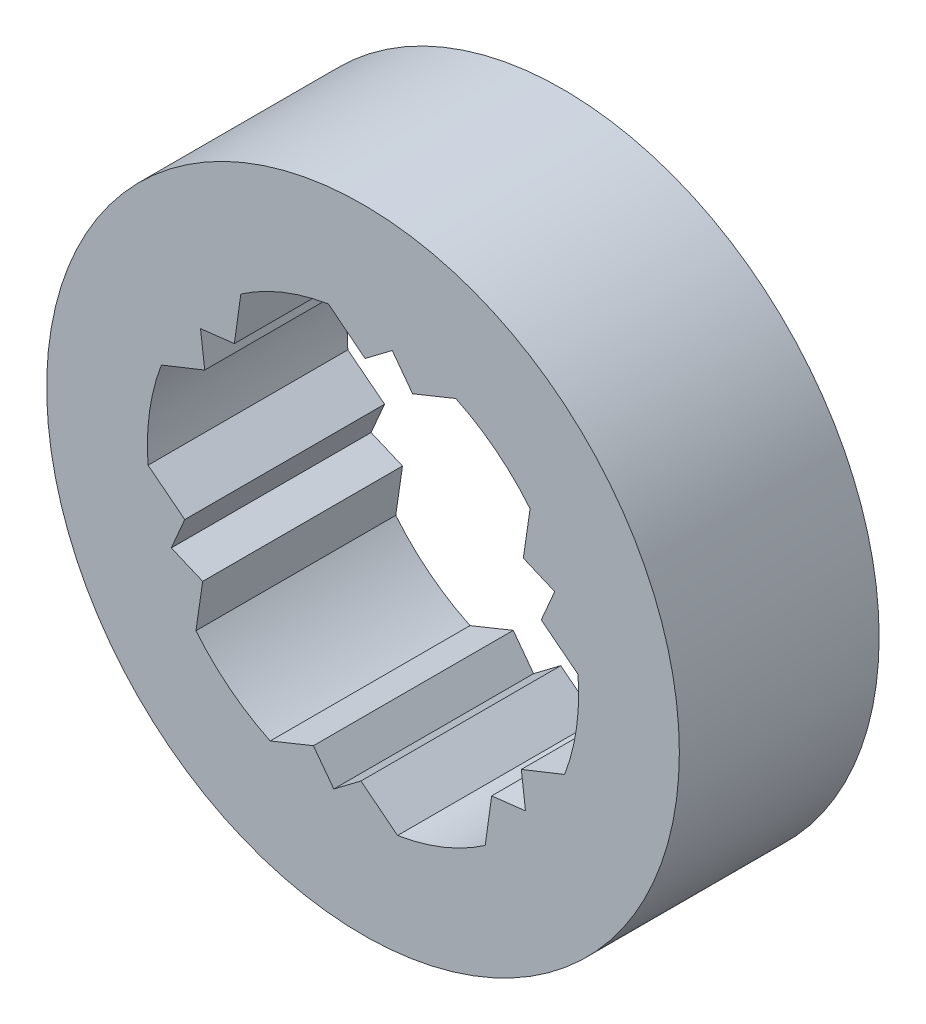
ISO-10303-21;
HEADER;
FILE_DESCRIPTION(('STEP AP214'),'2;1');
FILE_NAME('part.step','',(''),(''),'','','');
FILE_SCHEMA(('AUTOMOTIVE_DESIGN { 1 0 10303 214 1 1 1 1 }'));
ENDSEC;
DATA;
#1=APPLICATION_CONTEXT('core data for automotive mechanical design processes');
#2=APPLICATION_PROTOCOL_DEFINITION('international standard','automotive_design',2000,#1);
#3=PRODUCT_CONTEXT('',#1,'mechanical');
#4=PRODUCT('Part','Part','',(#3));
#5=PRODUCT_RELATED_PRODUCT_CATEGORY('part','',(#4));
#6=PRODUCT_DEFINITION_FORMATION('','',#4);
#7=PRODUCT_DEFINITION_CONTEXT('part definition',#1,'design');
#8=PRODUCT_DEFINITION('design','',#6,#7);
#9=PRODUCT_DEFINITION_SHAPE('','',#8);
#10=(LENGTH_UNIT() NAMED_UNIT(*) SI_UNIT(.MILLI.,.METRE.));
#11=(NAMED_UNIT(*) PLANE_ANGLE_UNIT() SI_UNIT($,.RADIAN.));
#12=(NAMED_UNIT(*) SI_UNIT($,.STERADIAN.) SOLID_ANGLE_UNIT());
#13=UNCERTAINTY_MEASURE_WITH_UNIT(LENGTH_MEASURE(1.E-05),#10,'distance_accuracy_value','');
#14=(GEOMETRIC_REPRESENTATION_CONTEXT(3) GLOBAL_UNCERTAINTY_ASSIGNED_CONTEXT((#13)) GLOBAL_UNIT_ASSIGNED_CONTEXT((#10,
#11,#12)) REPRESENTATION_CONTEXT('',''));
#15=CARTESIAN_POINT('',(0.,0.,0.));
#16=DIRECTION('',(0.,0.,1.));
#17=DIRECTION('',(1.,0.,0.));
#18=AXIS2_PLACEMENT_3D('',#15,#16,#17);
#19=CARTESIAN_POINT('',(-6.12693578866868,33.5955695744337,3.));
#20=DIRECTION('',(0.,0.,1.));
#21=DIRECTION('',(1.,0.,0.));
#22=AXIS2_PLACEMENT_3D('',#19,#20,#21);
#23=PLANE('',#22);
#24=CARTESIAN_POINT('',(-6.12693578866868,33.5955695744337,3.));
#25=DIRECTION('',(0.,0.,1.));
#26=DIRECTION('',(1.,0.,0.));
#27=AXIS2_PLACEMENT_3D('',#24,#25,#26);
#28=CIRCLE('',#27,4.74999999999999);
#29=CARTESIAN_POINT('',(-1.37693578866869,33.5955695744337,3.));
#30=VERTEX_POINT('',#29);
#31=EDGE_CURVE('E11',#30,#30,#28,.T.);
#32=ORIENTED_EDGE('',*,*,#31,.T.);
#33=EDGE_LOOP('',(#32));
#34=FACE_BOUND('',#33,.T.);
#35=DIRECTION('',(0.13844932774247,0.990369518739172,0.));
#36=VECTOR('',#35,1.);
#37=CARTESIAN_POINT('',(-4.19526989703299,31.62071296052,3.));
#38=LINE('',#37,#36);
#39=CARTESIAN_POINT('',(-4.29218442645271,30.9274542974026,3.));
#40=VERTEX_POINT('',#39);
#41=CARTESIAN_POINT('',(-4.19526989703299,31.62071296052,3.));
#42=VERTEX_POINT('',#41);
#43=EDGE_CURVE('E244',#40,#42,#38,.T.);
#44=ORIENTED_EDGE('',*,*,#43,.F.);
#45=CARTESIAN_POINT('',(-6.12693578866868,33.5955695744337,3.));
#46=DIRECTION('',(0.,0.,1.));
#47=DIRECTION('',(-1.,0.,0.));
#48=AXIS2_PLACEMENT_3D('',#45,#46,#47);
#49=CIRCLE('',#48,3.23807839507942);
#50=CARTESIAN_POINT('',(-5.60819906891922,30.3993117769049,3.));
#51=VERTEX_POINT('',#50);
#52=EDGE_CURVE('E236',#51,#40,#49,.T.);
#53=ORIENTED_EDGE('',*,*,#52,.F.);
#54=DIRECTION('',(0.784681674795159,-0.619898918567104,0.));
#55=VECTOR('',#54,1.);
#56=CARTESIAN_POINT('',(-6.1574762412758,30.8332410199018,3.));
#57=LINE('',#56,#55);
#58=CARTESIAN_POINT('',(-6.1574762412758,30.8332410199018,3.));
#59=VERTEX_POINT('',#58);
#60=EDGE_CURVE('E312',#59,#51,#57,.T.);
#61=ORIENTED_EDGE('',*,*,#60,.F.);
#62=DIRECTION('',(0.798195461078345,0.602398544083507,0.));
#63=VECTOR('',#62,1.);
#64=CARTESIAN_POINT('',(-6.56575494376265,30.5251128633897,3.));
#65=LINE('',#64,#63);
#66=CARTESIAN_POINT('',(-6.56575494376265,30.5251128633897,3.));
#67=VERTEX_POINT('',#66);
#68=EDGE_CURVE('E310',#67,#59,#65,.T.);
#69=ORIENTED_EDGE('',*,*,#68,.F.);
#70=DIRECTION('',(0.59750264893678,-0.80186693691256,0.));
#71=VECTOR('',#70,1.);
#72=CARTESIAN_POINT('',(-6.8713788393318,30.9352695336964,3.));
#73=LINE('',#72,#71);
#74=CARTESIAN_POINT('',(-6.8713788393318,30.9352695336964,3.));
#75=VERTEX_POINT('',#74);
#76=EDGE_CURVE('E308',#75,#67,#73,.T.);
#77=ORIENTED_EDGE('',*,*,#76,.F.);
#78=DIRECTION('',(0.926909826233128,0.375284124407724,0.));
#79=VECTOR('',#78,1.);
#80=CARTESIAN_POINT('',(-6.8713788393318,30.9352695336964,3.));
#81=LINE('',#80,#79);
#82=CARTESIAN_POINT('',(-7.52021571769499,30.672570646611,3.));
#83=VERTEX_POINT('',#82);
#84=EDGE_CURVE('E306',#83,#75,#81,.T.);
#85=ORIENTED_EDGE('',*,*,#84,.F.);
#86=CARTESIAN_POINT('',(-6.12693578866869,33.5955695744336,3.));
#87=DIRECTION('',(0.,0.,1.));
#88=DIRECTION('',(1.,0.,0.));
#89=AXIS2_PLACEMENT_3D('',#86,#87,#88);
#90=CIRCLE('',#89,3.23807839507941);
#91=CARTESIAN_POINT('',(-8.63560787849799,31.5482014984904,3.));
#92=VERTEX_POINT('',#91);
#93=EDGE_CURVE('E304',#92,#83,#90,.T.);
#94=ORIENTED_EDGE('',*,*,#93,.F.);
#95=DIRECTION('',(-0.144507373860064,-0.989503723540275,0.));
#96=VECTOR('',#95,1.);
#97=CARTESIAN_POINT('',(-8.53445271679595,32.2408541049686,3.));
#98=LINE('',#97,#96);
#99=CARTESIAN_POINT('',(-8.53445271679595,32.2408541049686,3.));
#100=VERTEX_POINT('',#99);
#101=EDGE_CURVE('E302',#100,#92,#98,.T.);
#102=ORIENTED_EDGE('',*,*,#101,.F.);
#103=DIRECTION('',(0.920790172918248,-0.390058274437529,0.));
#104=VECTOR('',#103,1.);
#105=CARTESIAN_POINT('',(-9.00543887920012,32.4403697548903,3.));
#106=LINE('',#105,#104);
#107=CARTESIAN_POINT('',(-9.00543887920012,32.4403697548903,3.));
#108=VERTEX_POINT('',#107);
#109=EDGE_CURVE('E300',#108,#100,#106,.T.);
#110=ORIENTED_EDGE('',*,*,#109,.F.);
#111=DIRECTION('',(-0.395685813352709,-0.918385941264023,0.));
#112=VECTOR('',#111,1.);
#113=CARTESIAN_POINT('',(-8.80304473096749,32.9101261476101,3.));
#114=LINE('',#113,#112);
#115=CARTESIAN_POINT('',(-8.80304473096749,32.9101261476101,3.));
#116=VERTEX_POINT('',#115);
#117=EDGE_CURVE('E298',#116,#108,#114,.T.);
#118=ORIENTED_EDGE('',*,*,#117,.F.);
#119=DIRECTION('',(0.788460498490676,-0.615085394331417,0.));
#120=VECTOR('',#119,1.);
#121=CARTESIAN_POINT('',(-8.80304473096749,32.9101261476101,3.));
#122=LINE('',#121,#120);
#123=CARTESIAN_POINT('',(-9.35496707991097,33.3406859236421,3.));
#124=VERTEX_POINT('',#123);
#125=EDGE_CURVE('E296',#124,#116,#122,.T.);
#126=ORIENTED_EDGE('',*,*,#125,.F.);
#127=CARTESIAN_POINT('',(-6.12693578866869,33.5955695744336,3.));
#128=DIRECTION('',(0.,0.,1.));
#129=DIRECTION('',(1.,0.,0.));
#130=AXIS2_PLACEMENT_3D('',#127,#128,#129);
#131=CIRCLE('',#130,3.23807839507943);
#132=CARTESIAN_POINT('',(-9.15434459824747,34.7444592960192,3.));
#133=VERTEX_POINT('',#132);
#134=EDGE_CURVE('E294',#133,#124,#131,.T.);
#135=ORIENTED_EDGE('',*,*,#134,.F.);
#136=DIRECTION('',(-0.929189048655209,-0.369604804973133,0.));
#137=VECTOR('',#136,1.);
#138=CARTESIAN_POINT('',(-8.50391226418881,35.0031826595004,3.));
#139=LINE('',#138,#137);
#140=CARTESIAN_POINT('',(-8.50391226418881,35.0031826595004,3.));
#141=VERTEX_POINT('',#140);
#142=EDGE_CURVE('E292',#141,#133,#139,.T.);
#143=ORIENTED_EDGE('',*,*,#142,.F.);
#144=DIRECTION('',(0.1225947118399,-0.992456818521034,0.));
#145=VECTOR('',#144,1.);
#146=CARTESIAN_POINT('',(-8.56661972410611,35.5108264659342,3.));
#147=LINE('',#146,#145);
#148=CARTESIAN_POINT('',(-8.56661972410611,35.5108264659342,3.));
#149=VERTEX_POINT('',#148);
#150=EDGE_CURVE('E290',#149,#141,#147,.T.);
#151=ORIENTED_EDGE('',*,*,#150,.F.);
#152=DIRECTION('',(-0.99318846228948,-0.116519004351467,0.));
#153=VECTOR('',#152,1.);
#154=CARTESIAN_POINT('',(-8.05860168030434,35.5704261883473,3.));
#155=LINE('',#154,#153);
#156=CARTESIAN_POINT('',(-8.05860168030434,35.5704261883473,3.));
#157=VERTEX_POINT('',#156);
#158=EDGE_CURVE('E288',#157,#149,#155,.T.);
#159=ORIENTED_EDGE('',*,*,#158,.F.);
#160=DIRECTION('',(-0.138449327742386,-0.990369518739183,0.));
#161=VECTOR('',#160,1.);
#162=CARTESIAN_POINT('',(-8.05860168030434,35.5704261883473,3.));
#163=LINE('',#162,#161);
#164=CARTESIAN_POINT('',(-7.96168715088467,36.2636848514648,3.));
#165=VERTEX_POINT('',#164);
#166=EDGE_CURVE('E286',#165,#157,#163,.T.);
#167=ORIENTED_EDGE('',*,*,#166,.F.);
#168=CARTESIAN_POINT('',(-6.12693578866871,33.5955695744337,3.));
#169=DIRECTION('',(0.,0.,1.));
#170=DIRECTION('',(1.,0.,0.));
#171=AXIS2_PLACEMENT_3D('',#168,#169,#170);
#172=CIRCLE('',#171,3.23807839507941);
#173=CARTESIAN_POINT('',(-6.64567250841817,36.7918273719625,3.));
#174=VERTEX_POINT('',#173);
#175=EDGE_CURVE('E284',#174,#165,#172,.T.);
#176=ORIENTED_EDGE('',*,*,#175,.F.);
#177=DIRECTION('',(-0.784681674795154,0.61989891856711,0.));
#178=VECTOR('',#177,1.);
#179=CARTESIAN_POINT('',(-6.09639533606153,36.3578981289655,3.));
#180=LINE('',#179,#178);
#181=CARTESIAN_POINT('',(-6.09639533606153,36.3578981289655,3.));
#182=VERTEX_POINT('',#181);
#183=EDGE_CURVE('E282',#182,#174,#180,.T.);
#184=ORIENTED_EDGE('',*,*,#183,.F.);
#185=DIRECTION('',(-0.798195461078354,-0.602398544083495,0.));
#186=VECTOR('',#185,1.);
#187=CARTESIAN_POINT('',(-5.68811663357468,36.6660262854775,3.));
#188=LINE('',#187,#186);
#189=CARTESIAN_POINT('',(-5.68811663357468,36.6660262854775,3.));
#190=VERTEX_POINT('',#189);
#191=EDGE_CURVE('E280',#190,#182,#188,.T.);
#192=ORIENTED_EDGE('',*,*,#191,.F.);
#193=DIRECTION('',(-0.59750264893678,0.80186693691256,0.));
#194=VECTOR('',#193,1.);
#195=CARTESIAN_POINT('',(-5.38249273800553,36.2558696151709,3.));
#196=LINE('',#195,#194);
#197=CARTESIAN_POINT('',(-5.38249273800553,36.2558696151709,3.));
#198=VERTEX_POINT('',#197);
#199=EDGE_CURVE('E278',#198,#190,#196,.T.);
#200=ORIENTED_EDGE('',*,*,#199,.F.);
#201=DIRECTION('',(-0.926909826233087,-0.375284124407825,0.));
#202=VECTOR('',#201,1.);
#203=CARTESIAN_POINT('',(-5.38249273800553,36.2558696151709,3.));
#204=LINE('',#203,#202);
#205=CARTESIAN_POINT('',(-4.7336558596424,36.5185685022564,3.));
#206=VERTEX_POINT('',#205);
#207=EDGE_CURVE('E276',#206,#198,#204,.T.);
#208=ORIENTED_EDGE('',*,*,#207,.F.);
#209=CARTESIAN_POINT('',(-6.12693578866871,33.5955695744337,3.));
#210=DIRECTION('',(0.,0.,1.));
#211=DIRECTION('',(1.,0.,0.));
#212=AXIS2_PLACEMENT_3D('',#209,#210,#211);
#213=CIRCLE('',#212,3.23807839507943);
#214=CARTESIAN_POINT('',(-3.61826369883939,35.6429376503769,3.));
#215=VERTEX_POINT('',#214);
#216=EDGE_CURVE('E274',#215,#206,#213,.T.);
#217=ORIENTED_EDGE('',*,*,#216,.F.);
#218=DIRECTION('',(0.144507373859996,0.989503723540284,0.));
#219=VECTOR('',#218,1.);
#220=CARTESIAN_POINT('',(-3.71941886054139,34.9502850438987,3.));
#221=LINE('',#220,#219);
#222=CARTESIAN_POINT('',(-3.71941886054139,34.9502850438987,3.));
#223=VERTEX_POINT('',#222);
#224=EDGE_CURVE('E272',#223,#215,#221,.T.);
#225=ORIENTED_EDGE('',*,*,#224,.F.);
#226=DIRECTION('',(-0.920790172918247,0.390058274437532,0.));
#227=VECTOR('',#226,1.);
#228=CARTESIAN_POINT('',(-3.24843269813723,34.750769393977,3.));
#229=LINE('',#228,#227);
#230=CARTESIAN_POINT('',(-3.24843269813723,34.750769393977,3.));
#231=VERTEX_POINT('',#230);
#232=EDGE_CURVE('E270',#231,#223,#229,.T.);
#233=ORIENTED_EDGE('',*,*,#232,.F.);
#234=DIRECTION('',(0.395685813352698,0.918385941264027,0.));
#235=VECTOR('',#234,1.);
#236=CARTESIAN_POINT('',(-3.45082684636986,34.2810130012572,3.));
#237=LINE('',#236,#235);
#238=CARTESIAN_POINT('',(-3.45082684636986,34.2810130012572,3.));
#239=VERTEX_POINT('',#238);
#240=EDGE_CURVE('E268',#239,#231,#237,.T.);
#241=ORIENTED_EDGE('',*,*,#240,.F.);
#242=DIRECTION('',(-0.788460498490699,0.615085394331388,0.));
#243=VECTOR('',#242,1.);
#244=CARTESIAN_POINT('',(-3.45082684636986,34.2810130012572,3.));
#245=LINE('',#244,#243);
#246=CARTESIAN_POINT('',(-2.89890449742642,33.8504532252253,3.));
#247=VERTEX_POINT('',#246);
#248=EDGE_CURVE('E266',#247,#239,#245,.T.);
#249=ORIENTED_EDGE('',*,*,#248,.F.);
#250=CARTESIAN_POINT('',(-6.12693578866868,33.5955695744337,3.));
#251=DIRECTION('',(0.,0.,1.));
#252=DIRECTION('',(1.,0.,0.));
#253=AXIS2_PLACEMENT_3D('',#250,#251,#252);
#254=CIRCLE('',#253,3.23807839507941);
#255=CARTESIAN_POINT('',(-3.09952697908992,32.4466798528481,3.));
#256=VERTEX_POINT('',#255);
#257=EDGE_CURVE('E264',#256,#247,#254,.T.);
#258=ORIENTED_EDGE('',*,*,#257,.F.);
#259=DIRECTION('',(0.929189048655185,0.369604804973194,0.));
#260=VECTOR('',#259,1.);
#261=CARTESIAN_POINT('',(-3.74995931314852,32.1879564893669,3.));
#262=LINE('',#261,#260);
#263=CARTESIAN_POINT('',(-3.74995931314852,32.1879564893669,3.));
#264=VERTEX_POINT('',#263);
#265=EDGE_CURVE('E262',#264,#256,#262,.T.);
#266=ORIENTED_EDGE('',*,*,#265,.F.);
#267=DIRECTION('',(-0.122594711839908,0.992456818521033,0.));
#268=VECTOR('',#267,1.);
#269=CARTESIAN_POINT('',(-3.68725185323122,31.6803126829331,3.));
#270=LINE('',#269,#268);
#271=CARTESIAN_POINT('',(-3.68725185323122,31.6803126829331,3.));
#272=VERTEX_POINT('',#271);
#273=EDGE_CURVE('E258',#272,#264,#270,.T.);
#274=ORIENTED_EDGE('',*,*,#273,.F.);
#275=DIRECTION('',(0.99318846228948,0.116519004351468,0.));
#276=VECTOR('',#275,1.);
#277=CARTESIAN_POINT('',(-4.19526989703299,31.62071296052,3.));
#278=LINE('',#277,#276);
#279=EDGE_CURVE('E256',#42,#272,#278,.T.);
#280=ORIENTED_EDGE('',*,*,#279,.F.);
#281=EDGE_LOOP('',(#44,#53,#61,#69,#77,#85,#94,#102,#110,#118,#126,#135,#143,#151,#159,#167,
#176,#184,#192,#200,#208,#217,#225,#233,#241,#249,#258,#266,#274,#280));
#282=FACE_BOUND('',#281,.T.);
#283=ADVANCED_FACE('F39',(#34,#282),#23,.T.);
#284=CARTESIAN_POINT('',(-6.12693578866868,33.5955695744337,0.));
#285=DIRECTION('',(0.,0.,1.));
#286=DIRECTION('',(1.,0.,0.));
#287=AXIS2_PLACEMENT_3D('',#284,#285,#286);
#288=PLANE('',#287);
#289=CARTESIAN_POINT('',(-6.12693578866868,33.5955695744337,0.));
#290=DIRECTION('',(0.,0.,1.));
#291=DIRECTION('',(1.,0.,0.));
#292=AXIS2_PLACEMENT_3D('',#289,#290,#291);
#293=CIRCLE('',#292,4.74999999999999);
#294=CARTESIAN_POINT('',(-1.37693578866869,33.5955695744337,0.));
#295=VERTEX_POINT('',#294);
#296=EDGE_CURVE('E43',#295,#295,#293,.T.);
#297=ORIENTED_EDGE('',*,*,#296,.F.);
#298=EDGE_LOOP('',(#297));
#299=FACE_BOUND('',#298,.T.);
#300=CARTESIAN_POINT('',(-6.12693578866868,33.5955695744337,0.));
#301=DIRECTION('',(0.,0.,1.));
#302=DIRECTION('',(-1.,0.,0.));
#303=AXIS2_PLACEMENT_3D('',#300,#301,#302);
#304=CIRCLE('',#303,3.23807839507942);
#305=CARTESIAN_POINT('',(-5.60819906891922,30.3993117769049,0.));
#306=VERTEX_POINT('',#305);
#307=CARTESIAN_POINT('',(-4.29218442645271,30.9274542974026,0.));
#308=VERTEX_POINT('',#307);
#309=EDGE_CURVE('E62',#306,#308,#304,.T.);
#310=ORIENTED_EDGE('',*,*,#309,.T.);
#311=DIRECTION('',(0.13844932774247,0.990369518739172,0.));
#312=VECTOR('',#311,1.);
#313=CARTESIAN_POINT('',(-4.19526989703299,31.62071296052,0.));
#314=LINE('',#313,#312);
#315=CARTESIAN_POINT('',(-4.19526989703299,31.62071296052,0.));
#316=VERTEX_POINT('',#315);
#317=EDGE_CURVE('E251',#308,#316,#314,.T.);
#318=ORIENTED_EDGE('',*,*,#317,.T.);
#319=DIRECTION('',(0.99318846228948,0.116519004351468,0.));
#320=VECTOR('',#319,1.);
#321=CARTESIAN_POINT('',(-4.19526989703299,31.62071296052,0.));
#322=LINE('',#321,#320);
#323=CARTESIAN_POINT('',(-3.68725185323122,31.6803126829331,0.));
#324=VERTEX_POINT('',#323);
#325=EDGE_CURVE('E316',#316,#324,#322,.T.);
#326=ORIENTED_EDGE('',*,*,#325,.T.);
#327=DIRECTION('',(-0.122594711839908,0.992456818521033,0.));
#328=VECTOR('',#327,1.);
#329=CARTESIAN_POINT('',(-3.68725185323122,31.6803126829331,0.));
#330=LINE('',#329,#328);
#331=CARTESIAN_POINT('',(-3.74995931314852,32.1879564893669,0.));
#332=VERTEX_POINT('',#331);
#333=EDGE_CURVE('E319',#324,#332,#330,.T.);
#334=ORIENTED_EDGE('',*,*,#333,.T.);
#335=DIRECTION('',(0.929189048655185,0.369604804973194,0.));
#336=VECTOR('',#335,1.);
#337=CARTESIAN_POINT('',(-3.74995931314852,32.1879564893669,0.));
#338=LINE('',#337,#336);
#339=CARTESIAN_POINT('',(-3.09952697908992,32.4466798528481,0.));
#340=VERTEX_POINT('',#339);
#341=EDGE_CURVE('E322',#332,#340,#338,.T.);
#342=ORIENTED_EDGE('',*,*,#341,.T.);
#343=CARTESIAN_POINT('',(-6.12693578866868,33.5955695744337,0.));
#344=DIRECTION('',(0.,0.,1.));
#345=DIRECTION('',(1.,0.,0.));
#346=AXIS2_PLACEMENT_3D('',#343,#344,#345);
#347=CIRCLE('',#346,3.23807839507941);
#348=CARTESIAN_POINT('',(-2.89890449742642,33.8504532252253,0.));
#349=VERTEX_POINT('',#348);
#350=EDGE_CURVE('E325',#340,#349,#347,.T.);
#351=ORIENTED_EDGE('',*,*,#350,.T.);
#352=DIRECTION('',(-0.788460498490699,0.615085394331388,0.));
#353=VECTOR('',#352,1.);
#354=CARTESIAN_POINT('',(-3.45082684636986,34.2810130012572,0.));
#355=LINE('',#354,#353);
#356=CARTESIAN_POINT('',(-3.45082684636986,34.2810130012572,0.));
#357=VERTEX_POINT('',#356);
#358=EDGE_CURVE('E328',#349,#357,#355,.T.);
#359=ORIENTED_EDGE('',*,*,#358,.T.);
#360=DIRECTION('',(0.395685813352698,0.918385941264027,0.));
#361=VECTOR('',#360,1.);
#362=CARTESIAN_POINT('',(-3.45082684636986,34.2810130012572,0.));
#363=LINE('',#362,#361);
#364=CARTESIAN_POINT('',(-3.24843269813723,34.750769393977,0.));
#365=VERTEX_POINT('',#364);
#366=EDGE_CURVE('E331',#357,#365,#363,.T.);
#367=ORIENTED_EDGE('',*,*,#366,.T.);
#368=DIRECTION('',(-0.920790172918247,0.390058274437532,0.));
#369=VECTOR('',#368,1.);
#370=CARTESIAN_POINT('',(-3.24843269813723,34.750769393977,0.));
#371=LINE('',#370,#369);
#372=CARTESIAN_POINT('',(-3.71941886054139,34.9502850438987,0.));
#373=VERTEX_POINT('',#372);
#374=EDGE_CURVE('E334',#365,#373,#371,.T.);
#375=ORIENTED_EDGE('',*,*,#374,.T.);
#376=DIRECTION('',(0.144507373859996,0.989503723540284,0.));
#377=VECTOR('',#376,1.);
#378=CARTESIAN_POINT('',(-3.71941886054139,34.9502850438987,0.));
#379=LINE('',#378,#377);
#380=CARTESIAN_POINT('',(-3.61826369883939,35.6429376503769,0.));
#381=VERTEX_POINT('',#380);
#382=EDGE_CURVE('E337',#373,#381,#379,.T.);
#383=ORIENTED_EDGE('',*,*,#382,.T.);
#384=CARTESIAN_POINT('',(-6.12693578866871,33.5955695744337,0.));
#385=DIRECTION('',(0.,0.,1.));
#386=DIRECTION('',(1.,0.,0.));
#387=AXIS2_PLACEMENT_3D('',#384,#385,#386);
#388=CIRCLE('',#387,3.23807839507943);
#389=CARTESIAN_POINT('',(-4.7336558596424,36.5185685022564,0.));
#390=VERTEX_POINT('',#389);
#391=EDGE_CURVE('E340',#381,#390,#388,.T.);
#392=ORIENTED_EDGE('',*,*,#391,.T.);
#393=DIRECTION('',(-0.926909826233087,-0.375284124407825,0.));
#394=VECTOR('',#393,1.);
#395=CARTESIAN_POINT('',(-5.38249273800553,36.2558696151709,0.));
#396=LINE('',#395,#394);
#397=CARTESIAN_POINT('',(-5.38249273800553,36.2558696151709,0.));
#398=VERTEX_POINT('',#397);
#399=EDGE_CURVE('E343',#390,#398,#396,.T.);
#400=ORIENTED_EDGE('',*,*,#399,.T.);
#401=DIRECTION('',(-0.59750264893678,0.80186693691256,0.));
#402=VECTOR('',#401,1.);
#403=CARTESIAN_POINT('',(-5.38249273800553,36.2558696151709,0.));
#404=LINE('',#403,#402);
#405=CARTESIAN_POINT('',(-5.68811663357468,36.6660262854775,0.));
#406=VERTEX_POINT('',#405);
#407=EDGE_CURVE('E346',#398,#406,#404,.T.);
#408=ORIENTED_EDGE('',*,*,#407,.T.);
#409=DIRECTION('',(-0.798195461078354,-0.602398544083495,0.));
#410=VECTOR('',#409,1.);
#411=CARTESIAN_POINT('',(-5.68811663357468,36.6660262854775,0.));
#412=LINE('',#411,#410);
#413=CARTESIAN_POINT('',(-6.09639533606153,36.3578981289655,0.));
#414=VERTEX_POINT('',#413);
#415=EDGE_CURVE('E349',#406,#414,#412,.T.);
#416=ORIENTED_EDGE('',*,*,#415,.T.);
#417=DIRECTION('',(-0.784681674795154,0.61989891856711,0.));
#418=VECTOR('',#417,1.);
#419=CARTESIAN_POINT('',(-6.09639533606153,36.3578981289655,0.));
#420=LINE('',#419,#418);
#421=CARTESIAN_POINT('',(-6.64567250841817,36.7918273719625,0.));
#422=VERTEX_POINT('',#421);
#423=EDGE_CURVE('E352',#414,#422,#420,.T.);
#424=ORIENTED_EDGE('',*,*,#423,.T.);
#425=CARTESIAN_POINT('',(-6.12693578866871,33.5955695744337,0.));
#426=DIRECTION('',(0.,0.,1.));
#427=DIRECTION('',(1.,0.,0.));
#428=AXIS2_PLACEMENT_3D('',#425,#426,#427);
#429=CIRCLE('',#428,3.23807839507941);
#430=CARTESIAN_POINT('',(-7.96168715088467,36.2636848514648,0.));
#431=VERTEX_POINT('',#430);
#432=EDGE_CURVE('E355',#422,#431,#429,.T.);
#433=ORIENTED_EDGE('',*,*,#432,.T.);
#434=DIRECTION('',(-0.138449327742386,-0.990369518739183,0.));
#435=VECTOR('',#434,1.);
#436=CARTESIAN_POINT('',(-8.05860168030434,35.5704261883473,0.));
#437=LINE('',#436,#435);
#438=CARTESIAN_POINT('',(-8.05860168030434,35.5704261883473,0.));
#439=VERTEX_POINT('',#438);
#440=EDGE_CURVE('E358',#431,#439,#437,.T.);
#441=ORIENTED_EDGE('',*,*,#440,.T.);
#442=DIRECTION('',(-0.99318846228948,-0.116519004351467,0.));
#443=VECTOR('',#442,1.);
#444=CARTESIAN_POINT('',(-8.05860168030434,35.5704261883473,0.));
#445=LINE('',#444,#443);
#446=CARTESIAN_POINT('',(-8.56661972410611,35.5108264659342,0.));
#447=VERTEX_POINT('',#446);
#448=EDGE_CURVE('E361',#439,#447,#445,.T.);
#449=ORIENTED_EDGE('',*,*,#448,.T.);
#450=DIRECTION('',(0.1225947118399,-0.992456818521034,0.));
#451=VECTOR('',#450,1.);
#452=CARTESIAN_POINT('',(-8.56661972410611,35.5108264659342,0.));
#453=LINE('',#452,#451);
#454=CARTESIAN_POINT('',(-8.50391226418881,35.0031826595004,0.));
#455=VERTEX_POINT('',#454);
#456=EDGE_CURVE('E364',#447,#455,#453,.T.);
#457=ORIENTED_EDGE('',*,*,#456,.T.);
#458=DIRECTION('',(-0.929189048655209,-0.369604804973133,0.));
#459=VECTOR('',#458,1.);
#460=CARTESIAN_POINT('',(-8.50391226418881,35.0031826595004,0.));
#461=LINE('',#460,#459);
#462=CARTESIAN_POINT('',(-9.15434459824747,34.7444592960192,0.));
#463=VERTEX_POINT('',#462);
#464=EDGE_CURVE('E367',#455,#463,#461,.T.);
#465=ORIENTED_EDGE('',*,*,#464,.T.);
#466=CARTESIAN_POINT('',(-6.12693578866869,33.5955695744336,0.));
#467=DIRECTION('',(0.,0.,1.));
#468=DIRECTION('',(1.,0.,0.));
#469=AXIS2_PLACEMENT_3D('',#466,#467,#468);
#470=CIRCLE('',#469,3.23807839507943);
#471=CARTESIAN_POINT('',(-9.35496707991097,33.3406859236421,0.));
#472=VERTEX_POINT('',#471);
#473=EDGE_CURVE('E370',#463,#472,#470,.T.);
#474=ORIENTED_EDGE('',*,*,#473,.T.);
#475=DIRECTION('',(0.788460498490676,-0.615085394331417,0.));
#476=VECTOR('',#475,1.);
#477=CARTESIAN_POINT('',(-8.80304473096749,32.9101261476101,0.));
#478=LINE('',#477,#476);
#479=CARTESIAN_POINT('',(-8.80304473096749,32.9101261476101,0.));
#480=VERTEX_POINT('',#479);
#481=EDGE_CURVE('E373',#472,#480,#478,.T.);
#482=ORIENTED_EDGE('',*,*,#481,.T.);
#483=DIRECTION('',(-0.395685813352709,-0.918385941264023,0.));
#484=VECTOR('',#483,1.);
#485=CARTESIAN_POINT('',(-8.80304473096749,32.9101261476101,0.));
#486=LINE('',#485,#484);
#487=CARTESIAN_POINT('',(-9.00543887920012,32.4403697548903,0.));
#488=VERTEX_POINT('',#487);
#489=EDGE_CURVE('E376',#480,#488,#486,.T.);
#490=ORIENTED_EDGE('',*,*,#489,.T.);
#491=DIRECTION('',(0.920790172918248,-0.390058274437529,0.));
#492=VECTOR('',#491,1.);
#493=CARTESIAN_POINT('',(-9.00543887920012,32.4403697548903,0.));
#494=LINE('',#493,#492);
#495=CARTESIAN_POINT('',(-8.53445271679595,32.2408541049686,0.));
#496=VERTEX_POINT('',#495);
#497=EDGE_CURVE('E379',#488,#496,#494,.T.);
#498=ORIENTED_EDGE('',*,*,#497,.T.);
#499=DIRECTION('',(-0.144507373860064,-0.989503723540275,0.));
#500=VECTOR('',#499,1.);
#501=CARTESIAN_POINT('',(-8.53445271679595,32.2408541049686,0.));
#502=LINE('',#501,#500);
#503=CARTESIAN_POINT('',(-8.63560787849799,31.5482014984904,0.));
#504=VERTEX_POINT('',#503);
#505=EDGE_CURVE('E382',#496,#504,#502,.T.);
#506=ORIENTED_EDGE('',*,*,#505,.T.);
#507=CARTESIAN_POINT('',(-6.12693578866869,33.5955695744336,0.));
#508=DIRECTION('',(0.,0.,1.));
#509=DIRECTION('',(1.,0.,0.));
#510=AXIS2_PLACEMENT_3D('',#507,#508,#509);
#511=CIRCLE('',#510,3.23807839507941);
#512=CARTESIAN_POINT('',(-7.52021571769499,30.672570646611,0.));
#513=VERTEX_POINT('',#512);
#514=EDGE_CURVE('E385',#504,#513,#511,.T.);
#515=ORIENTED_EDGE('',*,*,#514,.T.);
#516=DIRECTION('',(0.926909826233128,0.375284124407724,0.));
#517=VECTOR('',#516,1.);
#518=CARTESIAN_POINT('',(-6.8713788393318,30.9352695336964,0.));
#519=LINE('',#518,#517);
#520=CARTESIAN_POINT('',(-6.8713788393318,30.9352695336964,0.));
#521=VERTEX_POINT('',#520);
#522=EDGE_CURVE('E388',#513,#521,#519,.T.);
#523=ORIENTED_EDGE('',*,*,#522,.T.);
#524=DIRECTION('',(0.59750264893678,-0.80186693691256,0.));
#525=VECTOR('',#524,1.);
#526=CARTESIAN_POINT('',(-6.8713788393318,30.9352695336964,0.));
#527=LINE('',#526,#525);
#528=CARTESIAN_POINT('',(-6.56575494376265,30.5251128633897,0.));
#529=VERTEX_POINT('',#528);
#530=EDGE_CURVE('E391',#521,#529,#527,.T.);
#531=ORIENTED_EDGE('',*,*,#530,.T.);
#532=DIRECTION('',(0.798195461078345,0.602398544083507,0.));
#533=VECTOR('',#532,1.);
#534=CARTESIAN_POINT('',(-6.56575494376265,30.5251128633897,0.));
#535=LINE('',#534,#533);
#536=CARTESIAN_POINT('',(-6.1574762412758,30.8332410199018,0.));
#537=VERTEX_POINT('',#536);
#538=EDGE_CURVE('E394',#529,#537,#535,.T.);
#539=ORIENTED_EDGE('',*,*,#538,.T.);
#540=DIRECTION('',(0.784681674795159,-0.619898918567104,0.));
#541=VECTOR('',#540,1.);
#542=CARTESIAN_POINT('',(-6.1574762412758,30.8332410199018,0.));
#543=LINE('',#542,#541);
#544=EDGE_CURVE('E245',#537,#306,#543,.T.);
#545=ORIENTED_EDGE('',*,*,#544,.T.);
#546=EDGE_LOOP('',(#310,#318,#326,#334,#342,#351,#359,#367,#375,#383,#392,#400,#408,#416,#424,
#433,#441,#449,#457,#465,#474,#482,#490,#498,#506,#515,#523,#531,#539,#545));
#547=FACE_BOUND('',#546,.T.);
#548=ADVANCED_FACE('F459',(#299,#547),#288,.F.);
#549=CARTESIAN_POINT('',(-6.12693578866868,33.5955695744337,3.));
#550=DIRECTION('',(0.,0.,-1.));
#551=DIRECTION('',(-1.,0.,0.));
#552=AXIS2_PLACEMENT_3D('',#549,#550,#551);
#553=CYLINDRICAL_SURFACE('',#552,4.74999999999999);
#554=ORIENTED_EDGE('',*,*,#31,.F.);
#555=EDGE_LOOP('',(#554));
#556=FACE_BOUND('',#555,.T.);
#557=ORIENTED_EDGE('',*,*,#296,.T.);
#558=EDGE_LOOP('',(#557));
#559=FACE_BOUND('',#558,.T.);
#560=ADVANCED_FACE('F41',(#556,#559),#553,.T.);
#561=CARTESIAN_POINT('',(-6.12693578866868,33.5955695744337,3.));
#562=DIRECTION('',(0.,0.,-1.));
#563=DIRECTION('',(-1.,0.,0.));
#564=AXIS2_PLACEMENT_3D('',#561,#562,#563);
#565=CYLINDRICAL_SURFACE('',#564,3.23807839507942);
#566=ORIENTED_EDGE('',*,*,#309,.F.);
#567=DIRECTION('',(0.,0.,-1.));
#568=VECTOR('',#567,1.);
#569=CARTESIAN_POINT('',(-5.60819906891922,30.3993117769049,3.));
#570=LINE('',#569,#568);
#571=EDGE_CURVE('E240',#51,#306,#570,.T.);
#572=ORIENTED_EDGE('',*,*,#571,.F.);
#573=ORIENTED_EDGE('',*,*,#52,.T.);
#574=DIRECTION('',(0.,0.,-1.));
#575=VECTOR('',#574,1.);
#576=CARTESIAN_POINT('',(-4.29218442645271,30.9274542974026,3.));
#577=LINE('',#576,#575);
#578=EDGE_CURVE('E239',#40,#308,#577,.T.);
#579=ORIENTED_EDGE('',*,*,#578,.T.);
#580=EDGE_LOOP('',(#566,#572,#573,#579));
#581=FACE_BOUND('',#580,.T.);
#582=ADVANCED_FACE('F238',(#581),#565,.F.);
#583=CARTESIAN_POINT('',(-4.19526989703299,31.62071296052,3.));
#584=DIRECTION('',(-0.990369518739171,0.13844932774247,0.));
#585=DIRECTION('',(-0.13844932774247,-0.990369518739172,0.));
#586=AXIS2_PLACEMENT_3D('',#583,#584,#585);
#587=PLANE('',#586);
#588=ORIENTED_EDGE('',*,*,#317,.F.);
#589=ORIENTED_EDGE('',*,*,#578,.F.);
#590=ORIENTED_EDGE('',*,*,#43,.T.);
#591=DIRECTION('',(0.,0.,-1.));
#592=VECTOR('',#591,1.);
#593=CARTESIAN_POINT('',(-4.19526989703299,31.62071296052,3.));
#594=LINE('',#593,#592);
#595=EDGE_CURVE('E252',#42,#316,#594,.T.);
#596=ORIENTED_EDGE('',*,*,#595,.T.);
#597=EDGE_LOOP('',(#588,#589,#590,#596));
#598=FACE_BOUND('',#597,.T.);
#599=ADVANCED_FACE('F248',(#598),#587,.T.);
#600=CARTESIAN_POINT('',(-4.19526989703299,31.62071296052,3.));
#601=DIRECTION('',(-0.116519004351468,0.99318846228948,0.));
#602=DIRECTION('',(-0.99318846228948,-0.116519004351468,0.));
#603=AXIS2_PLACEMENT_3D('',#600,#601,#602);
#604=PLANE('',#603);
#605=ORIENTED_EDGE('',*,*,#325,.F.);
#606=ORIENTED_EDGE('',*,*,#595,.F.);
#607=ORIENTED_EDGE('',*,*,#279,.T.);
#608=DIRECTION('',(0.,0.,-1.));
#609=VECTOR('',#608,1.);
#610=CARTESIAN_POINT('',(-3.68725185323122,31.6803126829331,3.));
#611=LINE('',#610,#609);
#612=EDGE_CURVE('E451',#272,#324,#611,.T.);
#613=ORIENTED_EDGE('',*,*,#612,.T.);
#614=EDGE_LOOP('',(#605,#606,#607,#613));
#615=FACE_BOUND('',#614,.T.);
#616=ADVANCED_FACE('F455',(#615),#604,.T.);
#617=CARTESIAN_POINT('',(-3.68725185323122,31.6803126829331,3.));
#618=DIRECTION('',(-0.992456818521033,-0.122594711839908,0.));
#619=DIRECTION('',(0.122594711839908,-0.992456818521033,0.));
#620=AXIS2_PLACEMENT_3D('',#617,#618,#619);
#621=PLANE('',#620);
#622=ORIENTED_EDGE('',*,*,#333,.F.);
#623=ORIENTED_EDGE('',*,*,#612,.F.);
#624=ORIENTED_EDGE('',*,*,#273,.T.);
#625=DIRECTION('',(0.,0.,-1.));
#626=VECTOR('',#625,1.);
#627=CARTESIAN_POINT('',(-3.74995931314852,32.1879564893669,3.));
#628=LINE('',#627,#626);
#629=EDGE_CURVE('E449',#264,#332,#628,.T.);
#630=ORIENTED_EDGE('',*,*,#629,.T.);
#631=EDGE_LOOP('',(#622,#623,#624,#630));
#632=FACE_BOUND('',#631,.T.);
#633=ADVANCED_FACE('F587',(#632),#621,.T.);
#634=CARTESIAN_POINT('',(-3.74995931314852,32.1879564893669,3.));
#635=DIRECTION('',(-0.369604804973194,0.929189048655185,0.));
#636=DIRECTION('',(-0.929189048655185,-0.369604804973194,0.));
#637=AXIS2_PLACEMENT_3D('',#634,#635,#636);
#638=PLANE('',#637);
#639=ORIENTED_EDGE('',*,*,#341,.F.);
#640=ORIENTED_EDGE('',*,*,#629,.F.);
#641=ORIENTED_EDGE('',*,*,#265,.T.);
#642=DIRECTION('',(0.,0.,-1.));
#643=VECTOR('',#642,1.);
#644=CARTESIAN_POINT('',(-3.09952697908992,32.4466798528481,3.));
#645=LINE('',#644,#643);
#646=EDGE_CURVE('E447',#256,#340,#645,.T.);
#647=ORIENTED_EDGE('',*,*,#646,.T.);
#648=EDGE_LOOP('',(#639,#640,#641,#647));
#649=FACE_BOUND('',#648,.T.);
#650=ADVANCED_FACE('F585',(#649),#638,.T.);
#651=CARTESIAN_POINT('',(-6.12693578866868,33.5955695744337,3.));
#652=DIRECTION('',(0.,0.,-1.));
#653=DIRECTION('',(-1.,0.,0.));
#654=AXIS2_PLACEMENT_3D('',#651,#652,#653);
#655=CYLINDRICAL_SURFACE('',#654,3.23807839507941);
#656=ORIENTED_EDGE('',*,*,#350,.F.);
#657=ORIENTED_EDGE('',*,*,#646,.F.);
#658=ORIENTED_EDGE('',*,*,#257,.T.);
#659=DIRECTION('',(0.,0.,-1.));
#660=VECTOR('',#659,1.);
#661=CARTESIAN_POINT('',(-2.89890449742642,33.8504532252253,3.));
#662=LINE('',#661,#660);
#663=EDGE_CURVE('E445',#247,#349,#662,.T.);
#664=ORIENTED_EDGE('',*,*,#663,.T.);
#665=EDGE_LOOP('',(#656,#657,#658,#664));
#666=FACE_BOUND('',#665,.T.);
#667=ADVANCED_FACE('F579',(#666),#655,.F.);
#668=CARTESIAN_POINT('',(-3.45082684636986,34.2810130012572,3.));
#669=DIRECTION('',(-0.615085394331388,-0.788460498490698,0.));
#670=DIRECTION('',(0.788460498490699,-0.615085394331388,0.));
#671=AXIS2_PLACEMENT_3D('',#668,#669,#670);
#672=PLANE('',#671);
#673=ORIENTED_EDGE('',*,*,#358,.F.);
#674=ORIENTED_EDGE('',*,*,#663,.F.);
#675=ORIENTED_EDGE('',*,*,#248,.T.);
#676=DIRECTION('',(0.,0.,-1.));
#677=VECTOR('',#676,1.);
#678=CARTESIAN_POINT('',(-3.45082684636986,34.2810130012572,3.));
#679=LINE('',#678,#677);
#680=EDGE_CURVE('E443',#239,#357,#679,.T.);
#681=ORIENTED_EDGE('',*,*,#680,.T.);
#682=EDGE_LOOP('',(#673,#674,#675,#681));
#683=FACE_BOUND('',#682,.T.);
#684=ADVANCED_FACE('F575',(#683),#672,.T.);
#685=CARTESIAN_POINT('',(-3.45082684636986,34.2810130012572,3.));
#686=DIRECTION('',(-0.918385941264028,0.395685813352698,0.));
#687=DIRECTION('',(-0.395685813352698,-0.918385941264028,0.));
#688=AXIS2_PLACEMENT_3D('',#685,#686,#687);
#689=PLANE('',#688);
#690=ORIENTED_EDGE('',*,*,#366,.F.);
#691=ORIENTED_EDGE('',*,*,#680,.F.);
#692=ORIENTED_EDGE('',*,*,#240,.T.);
#693=DIRECTION('',(0.,0.,-1.));
#694=VECTOR('',#693,1.);
#695=CARTESIAN_POINT('',(-3.24843269813723,34.750769393977,3.));
#696=LINE('',#695,#694);
#697=EDGE_CURVE('E441',#231,#365,#696,.T.);
#698=ORIENTED_EDGE('',*,*,#697,.T.);
#699=EDGE_LOOP('',(#690,#691,#692,#698));
#700=FACE_BOUND('',#699,.T.);
#701=ADVANCED_FACE('F572',(#700),#689,.T.);
#702=CARTESIAN_POINT('',(-3.24843269813723,34.750769393977,3.));
#703=DIRECTION('',(-0.390058274437532,-0.920790172918247,0.));
#704=DIRECTION('',(0.920790172918247,-0.390058274437532,0.));
#705=AXIS2_PLACEMENT_3D('',#702,#703,#704);
#706=PLANE('',#705);
#707=ORIENTED_EDGE('',*,*,#374,.F.);
#708=ORIENTED_EDGE('',*,*,#697,.F.);
#709=ORIENTED_EDGE('',*,*,#232,.T.);
#710=DIRECTION('',(0.,0.,-1.));
#711=VECTOR('',#710,1.);
#712=CARTESIAN_POINT('',(-3.71941886054139,34.9502850438987,3.));
#713=LINE('',#712,#711);
#714=EDGE_CURVE('E439',#223,#373,#713,.T.);
#715=ORIENTED_EDGE('',*,*,#714,.T.);
#716=EDGE_LOOP('',(#707,#708,#709,#715));
#717=FACE_BOUND('',#716,.T.);
#718=ADVANCED_FACE('F564',(#717),#706,.T.);
#719=CARTESIAN_POINT('',(-3.71941886054139,34.9502850438987,3.));
#720=DIRECTION('',(-0.989503723540284,0.144507373859996,0.));
#721=DIRECTION('',(-0.144507373859996,-0.989503723540284,0.));
#722=AXIS2_PLACEMENT_3D('',#719,#720,#721);
#723=PLANE('',#722);
#724=ORIENTED_EDGE('',*,*,#382,.F.);
#725=ORIENTED_EDGE('',*,*,#714,.F.);
#726=ORIENTED_EDGE('',*,*,#224,.T.);
#727=DIRECTION('',(0.,0.,-1.));
#728=VECTOR('',#727,1.);
#729=CARTESIAN_POINT('',(-3.61826369883939,35.6429376503769,3.));
#730=LINE('',#729,#728);
#731=EDGE_CURVE('E437',#215,#381,#730,.T.);
#732=ORIENTED_EDGE('',*,*,#731,.T.);
#733=EDGE_LOOP('',(#724,#725,#726,#732));
#734=FACE_BOUND('',#733,.T.);
#735=ADVANCED_FACE('F560',(#734),#723,.T.);
#736=CARTESIAN_POINT('',(-6.12693578866871,33.5955695744337,3.));
#737=DIRECTION('',(0.,0.,-1.));
#738=DIRECTION('',(-1.,0.,0.));
#739=AXIS2_PLACEMENT_3D('',#736,#737,#738);
#740=CYLINDRICAL_SURFACE('',#739,3.23807839507943);
#741=ORIENTED_EDGE('',*,*,#391,.F.);
#742=ORIENTED_EDGE('',*,*,#731,.F.);
#743=ORIENTED_EDGE('',*,*,#216,.T.);
#744=DIRECTION('',(0.,0.,-1.));
#745=VECTOR('',#744,1.);
#746=CARTESIAN_POINT('',(-4.7336558596424,36.5185685022564,3.));
#747=LINE('',#746,#745);
#748=EDGE_CURVE('E435',#206,#390,#747,.T.);
#749=ORIENTED_EDGE('',*,*,#748,.T.);
#750=EDGE_LOOP('',(#741,#742,#743,#749));
#751=FACE_BOUND('',#750,.T.);
#752=ADVANCED_FACE('F557',(#751),#740,.F.);
#753=CARTESIAN_POINT('',(-5.38249273800553,36.2558696151709,3.));
#754=DIRECTION('',(0.375284124407825,-0.926909826233087,0.));
#755=DIRECTION('',(0.926909826233087,0.375284124407825,0.));
#756=AXIS2_PLACEMENT_3D('',#753,#754,#755);
#757=PLANE('',#756);
#758=ORIENTED_EDGE('',*,*,#399,.F.);
#759=ORIENTED_EDGE('',*,*,#748,.F.);
#760=ORIENTED_EDGE('',*,*,#207,.T.);
#761=DIRECTION('',(0.,0.,-1.));
#762=VECTOR('',#761,1.);
#763=CARTESIAN_POINT('',(-5.38249273800553,36.2558696151709,3.));
#764=LINE('',#763,#762);
#765=EDGE_CURVE('E433',#198,#398,#764,.T.);
#766=ORIENTED_EDGE('',*,*,#765,.T.);
#767=EDGE_LOOP('',(#758,#759,#760,#766));
#768=FACE_BOUND('',#767,.T.);
#769=ADVANCED_FACE('F549',(#768),#757,.T.);
#770=CARTESIAN_POINT('',(-5.38249273800553,36.2558696151709,3.));
#771=DIRECTION('',(-0.80186693691256,-0.59750264893678,0.));
#772=DIRECTION('',(0.59750264893678,-0.80186693691256,0.));
#773=AXIS2_PLACEMENT_3D('',#770,#771,#772);
#774=PLANE('',#773);
#775=ORIENTED_EDGE('',*,*,#407,.F.);
#776=ORIENTED_EDGE('',*,*,#765,.F.);
#777=ORIENTED_EDGE('',*,*,#199,.T.);
#778=DIRECTION('',(0.,0.,-1.));
#779=VECTOR('',#778,1.);
#780=CARTESIAN_POINT('',(-5.68811663357468,36.6660262854775,3.));
#781=LINE('',#780,#779);
#782=EDGE_CURVE('E431',#190,#406,#781,.T.);
#783=ORIENTED_EDGE('',*,*,#782,.T.);
#784=EDGE_LOOP('',(#775,#776,#777,#783));
#785=FACE_BOUND('',#784,.T.);
#786=ADVANCED_FACE('F545',(#785),#774,.T.);
#787=CARTESIAN_POINT('',(-5.68811663357468,36.6660262854775,3.));
#788=DIRECTION('',(0.602398544083495,-0.798195461078353,0.));
#789=DIRECTION('',(0.798195461078354,0.602398544083495,0.));
#790=AXIS2_PLACEMENT_3D('',#787,#788,#789);
#791=PLANE('',#790);
#792=ORIENTED_EDGE('',*,*,#415,.F.);
#793=ORIENTED_EDGE('',*,*,#782,.F.);
#794=ORIENTED_EDGE('',*,*,#191,.T.);
#795=DIRECTION('',(0.,0.,-1.));
#796=VECTOR('',#795,1.);
#797=CARTESIAN_POINT('',(-6.09639533606153,36.3578981289655,3.));
#798=LINE('',#797,#796);
#799=EDGE_CURVE('E429',#182,#414,#798,.T.);
#800=ORIENTED_EDGE('',*,*,#799,.T.);
#801=EDGE_LOOP('',(#792,#793,#794,#800));
#802=FACE_BOUND('',#801,.T.);
#803=ADVANCED_FACE('F542',(#802),#791,.T.);
#804=CARTESIAN_POINT('',(-6.09639533606153,36.3578981289655,3.));
#805=DIRECTION('',(-0.61989891856711,-0.784681674795154,0.));
#806=DIRECTION('',(0.784681674795154,-0.61989891856711,0.));
#807=AXIS2_PLACEMENT_3D('',#804,#805,#806);
#808=PLANE('',#807);
#809=ORIENTED_EDGE('',*,*,#423,.F.);
#810=ORIENTED_EDGE('',*,*,#799,.F.);
#811=ORIENTED_EDGE('',*,*,#183,.T.);
#812=DIRECTION('',(0.,0.,-1.));
#813=VECTOR('',#812,1.);
#814=CARTESIAN_POINT('',(-6.64567250841817,36.7918273719625,3.));
#815=LINE('',#814,#813);
#816=EDGE_CURVE('E427',#174,#422,#815,.T.);
#817=ORIENTED_EDGE('',*,*,#816,.T.);
#818=EDGE_LOOP('',(#809,#810,#811,#817));
#819=FACE_BOUND('',#818,.T.);
#820=ADVANCED_FACE('F534',(#819),#808,.T.);
#821=CARTESIAN_POINT('',(-6.12693578866871,33.5955695744337,3.));
#822=DIRECTION('',(0.,0.,-1.));
#823=DIRECTION('',(-1.,0.,0.));
#824=AXIS2_PLACEMENT_3D('',#821,#822,#823);
#825=CYLINDRICAL_SURFACE('',#824,3.23807839507941);
#826=ORIENTED_EDGE('',*,*,#432,.F.);
#827=ORIENTED_EDGE('',*,*,#816,.F.);
#828=ORIENTED_EDGE('',*,*,#175,.T.);
#829=DIRECTION('',(0.,0.,-1.));
#830=VECTOR('',#829,1.);
#831=CARTESIAN_POINT('',(-7.96168715088467,36.2636848514648,3.));
#832=LINE('',#831,#830);
#833=EDGE_CURVE('E425',#165,#431,#832,.T.);
#834=ORIENTED_EDGE('',*,*,#833,.T.);
#835=EDGE_LOOP('',(#826,#827,#828,#834));
#836=FACE_BOUND('',#835,.T.);
#837=ADVANCED_FACE('F530',(#836),#825,.F.);
#838=CARTESIAN_POINT('',(-8.05860168030434,35.5704261883473,3.));
#839=DIRECTION('',(0.990369518739183,-0.138449327742386,0.));
#840=DIRECTION('',(0.138449327742386,0.990369518739183,0.));
#841=AXIS2_PLACEMENT_3D('',#838,#839,#840);
#842=PLANE('',#841);
#843=ORIENTED_EDGE('',*,*,#440,.F.);
#844=ORIENTED_EDGE('',*,*,#833,.F.);
#845=ORIENTED_EDGE('',*,*,#166,.T.);
#846=DIRECTION('',(0.,0.,-1.));
#847=VECTOR('',#846,1.);
#848=CARTESIAN_POINT('',(-8.05860168030434,35.5704261883473,3.));
#849=LINE('',#848,#847);
#850=EDGE_CURVE('E423',#157,#439,#849,.T.);
#851=ORIENTED_EDGE('',*,*,#850,.T.);
#852=EDGE_LOOP('',(#843,#844,#845,#851));
#853=FACE_BOUND('',#852,.T.);
#854=ADVANCED_FACE('F527',(#853),#842,.T.);
#855=CARTESIAN_POINT('',(-8.05860168030434,35.5704261883473,3.));
#856=DIRECTION('',(0.116519004351467,-0.99318846228948,0.));
#857=DIRECTION('',(0.99318846228948,0.116519004351467,0.));
#858=AXIS2_PLACEMENT_3D('',#855,#856,#857);
#859=PLANE('',#858);
#860=ORIENTED_EDGE('',*,*,#448,.F.);
#861=ORIENTED_EDGE('',*,*,#850,.F.);
#862=ORIENTED_EDGE('',*,*,#158,.T.);
#863=DIRECTION('',(0.,0.,-1.));
#864=VECTOR('',#863,1.);
#865=CARTESIAN_POINT('',(-8.56661972410611,35.5108264659342,3.));
#866=LINE('',#865,#864);
#867=EDGE_CURVE('E421',#149,#447,#866,.T.);
#868=ORIENTED_EDGE('',*,*,#867,.T.);
#869=EDGE_LOOP('',(#860,#861,#862,#868));
#870=FACE_BOUND('',#869,.T.);
#871=ADVANCED_FACE('F519',(#870),#859,.T.);
#872=CARTESIAN_POINT('',(-8.56661972410611,35.5108264659342,3.));
#873=DIRECTION('',(0.992456818521034,0.1225947118399,0.));
#874=DIRECTION('',(-0.1225947118399,0.992456818521034,0.));
#875=AXIS2_PLACEMENT_3D('',#872,#873,#874);
#876=PLANE('',#875);
#877=ORIENTED_EDGE('',*,*,#456,.F.);
#878=ORIENTED_EDGE('',*,*,#867,.F.);
#879=ORIENTED_EDGE('',*,*,#150,.T.);
#880=DIRECTION('',(0.,0.,-1.));
#881=VECTOR('',#880,1.);
#882=CARTESIAN_POINT('',(-8.50391226418881,35.0031826595004,3.));
#883=LINE('',#882,#881);
#884=EDGE_CURVE('E419',#141,#455,#883,.T.);
#885=ORIENTED_EDGE('',*,*,#884,.T.);
#886=EDGE_LOOP('',(#877,#878,#879,#885));
#887=FACE_BOUND('',#886,.T.);
#888=ADVANCED_FACE('F515',(#887),#876,.T.);
#889=CARTESIAN_POINT('',(-8.50391226418881,35.0031826595004,3.));
#890=DIRECTION('',(0.369604804973133,-0.929189048655209,0.));
#891=DIRECTION('',(0.929189048655209,0.369604804973133,0.));
#892=AXIS2_PLACEMENT_3D('',#889,#890,#891);
#893=PLANE('',#892);
#894=ORIENTED_EDGE('',*,*,#464,.F.);
#895=ORIENTED_EDGE('',*,*,#884,.F.);
#896=ORIENTED_EDGE('',*,*,#142,.T.);
#897=DIRECTION('',(0.,0.,-1.));
#898=VECTOR('',#897,1.);
#899=CARTESIAN_POINT('',(-9.15434459824747,34.7444592960192,3.));
#900=LINE('',#899,#898);
#901=EDGE_CURVE('E417',#133,#463,#900,.T.);
#902=ORIENTED_EDGE('',*,*,#901,.T.);
#903=EDGE_LOOP('',(#894,#895,#896,#902));
#904=FACE_BOUND('',#903,.T.);
#905=ADVANCED_FACE('F512',(#904),#893,.T.);
#906=CARTESIAN_POINT('',(-6.12693578866869,33.5955695744336,3.));
#907=DIRECTION('',(0.,0.,-1.));
#908=DIRECTION('',(-1.,0.,0.));
#909=AXIS2_PLACEMENT_3D('',#906,#907,#908);
#910=CYLINDRICAL_SURFACE('',#909,3.23807839507943);
#911=ORIENTED_EDGE('',*,*,#473,.F.);
#912=ORIENTED_EDGE('',*,*,#901,.F.);
#913=ORIENTED_EDGE('',*,*,#134,.T.);
#914=DIRECTION('',(0.,0.,-1.));
#915=VECTOR('',#914,1.);
#916=CARTESIAN_POINT('',(-9.35496707991097,33.3406859236421,3.));
#917=LINE('',#916,#915);
#918=EDGE_CURVE('E415',#124,#472,#917,.T.);
#919=ORIENTED_EDGE('',*,*,#918,.T.);
#920=EDGE_LOOP('',(#911,#912,#913,#919));
#921=FACE_BOUND('',#920,.T.);
#922=ADVANCED_FACE('F504',(#921),#910,.F.);
#923=CARTESIAN_POINT('',(-8.80304473096749,32.9101261476101,3.));
#924=DIRECTION('',(0.615085394331417,0.788460498490676,0.));
#925=DIRECTION('',(-0.788460498490676,0.615085394331417,0.));
#926=AXIS2_PLACEMENT_3D('',#923,#924,#925);
#927=PLANE('',#926);
#928=ORIENTED_EDGE('',*,*,#481,.F.);
#929=ORIENTED_EDGE('',*,*,#918,.F.);
#930=ORIENTED_EDGE('',*,*,#125,.T.);
#931=DIRECTION('',(0.,0.,-1.));
#932=VECTOR('',#931,1.);
#933=CARTESIAN_POINT('',(-8.80304473096749,32.9101261476101,3.));
#934=LINE('',#933,#932);
#935=EDGE_CURVE('E413',#116,#480,#934,.T.);
#936=ORIENTED_EDGE('',*,*,#935,.T.);
#937=EDGE_LOOP('',(#928,#929,#930,#936));
#938=FACE_BOUND('',#937,.T.);
#939=ADVANCED_FACE('F500',(#938),#927,.T.);
#940=CARTESIAN_POINT('',(-8.80304473096749,32.9101261476101,3.));
#941=DIRECTION('',(0.918385941264023,-0.395685813352709,0.));
#942=DIRECTION('',(0.395685813352709,0.918385941264023,0.));
#943=AXIS2_PLACEMENT_3D('',#940,#941,#942);
#944=PLANE('',#943);
#945=ORIENTED_EDGE('',*,*,#489,.F.);
#946=ORIENTED_EDGE('',*,*,#935,.F.);
#947=ORIENTED_EDGE('',*,*,#117,.T.);
#948=DIRECTION('',(0.,0.,-1.));
#949=VECTOR('',#948,1.);
#950=CARTESIAN_POINT('',(-9.00543887920012,32.4403697548903,3.));
#951=LINE('',#950,#949);
#952=EDGE_CURVE('E411',#108,#488,#951,.T.);
#953=ORIENTED_EDGE('',*,*,#952,.T.);
#954=EDGE_LOOP('',(#945,#946,#947,#953));
#955=FACE_BOUND('',#954,.T.);
#956=ADVANCED_FACE('F497',(#955),#944,.T.);
#957=CARTESIAN_POINT('',(-9.00543887920012,32.4403697548903,3.));
#958=DIRECTION('',(0.390058274437529,0.920790172918248,0.));
#959=DIRECTION('',(-0.920790172918248,0.39005827443753,0.));
#960=AXIS2_PLACEMENT_3D('',#957,#958,#959);
#961=PLANE('',#960);
#962=ORIENTED_EDGE('',*,*,#497,.F.);
#963=ORIENTED_EDGE('',*,*,#952,.F.);
#964=ORIENTED_EDGE('',*,*,#109,.T.);
#965=DIRECTION('',(0.,0.,-1.));
#966=VECTOR('',#965,1.);
#967=CARTESIAN_POINT('',(-8.53445271679595,32.2408541049686,3.));
#968=LINE('',#967,#966);
#969=EDGE_CURVE('E409',#100,#496,#968,.T.);
#970=ORIENTED_EDGE('',*,*,#969,.T.);
#971=EDGE_LOOP('',(#962,#963,#964,#970));
#972=FACE_BOUND('',#971,.T.);
#973=ADVANCED_FACE('F489',(#972),#961,.T.);
#974=CARTESIAN_POINT('',(-8.53445271679595,32.2408541049686,3.));
#975=DIRECTION('',(0.989503723540274,-0.144507373860064,0.));
#976=DIRECTION('',(0.144507373860064,0.989503723540275,0.));
#977=AXIS2_PLACEMENT_3D('',#974,#975,#976);
#978=PLANE('',#977);
#979=ORIENTED_EDGE('',*,*,#505,.F.);
#980=ORIENTED_EDGE('',*,*,#969,.F.);
#981=ORIENTED_EDGE('',*,*,#101,.T.);
#982=DIRECTION('',(0.,0.,-1.));
#983=VECTOR('',#982,1.);
#984=CARTESIAN_POINT('',(-8.63560787849799,31.5482014984904,3.));
#985=LINE('',#984,#983);
#986=EDGE_CURVE('E407',#92,#504,#985,.T.);
#987=ORIENTED_EDGE('',*,*,#986,.T.);
#988=EDGE_LOOP('',(#979,#980,#981,#987));
#989=FACE_BOUND('',#988,.T.);
#990=ADVANCED_FACE('F485',(#989),#978,.T.);
#991=CARTESIAN_POINT('',(-6.12693578866869,33.5955695744336,3.));
#992=DIRECTION('',(0.,0.,-1.));
#993=DIRECTION('',(-1.,0.,0.));
#994=AXIS2_PLACEMENT_3D('',#991,#992,#993);
#995=CYLINDRICAL_SURFACE('',#994,3.23807839507941);
#996=ORIENTED_EDGE('',*,*,#514,.F.);
#997=ORIENTED_EDGE('',*,*,#986,.F.);
#998=ORIENTED_EDGE('',*,*,#93,.T.);
#999=DIRECTION('',(0.,0.,-1.));
#1000=VECTOR('',#999,1.);
#1001=CARTESIAN_POINT('',(-7.52021571769499,30.672570646611,3.));
#1002=LINE('',#1001,#1000);
#1003=EDGE_CURVE('E405',#83,#513,#1002,.T.);
#1004=ORIENTED_EDGE('',*,*,#1003,.T.);
#1005=EDGE_LOOP('',(#996,#997,#998,#1004));
#1006=FACE_BOUND('',#1005,.T.);
#1007=ADVANCED_FACE('F482',(#1006),#995,.F.);
#1008=CARTESIAN_POINT('',(-6.8713788393318,30.9352695336964,3.));
#1009=DIRECTION('',(-0.375284124407724,0.926909826233128,0.));
#1010=DIRECTION('',(-0.926909826233129,-0.375284124407724,0.));
#1011=AXIS2_PLACEMENT_3D('',#1008,#1009,#1010);
#1012=PLANE('',#1011);
#1013=ORIENTED_EDGE('',*,*,#522,.F.);
#1014=ORIENTED_EDGE('',*,*,#1003,.F.);
#1015=ORIENTED_EDGE('',*,*,#84,.T.);
#1016=DIRECTION('',(0.,0.,-1.));
#1017=VECTOR('',#1016,1.);
#1018=CARTESIAN_POINT('',(-6.8713788393318,30.9352695336964,3.));
#1019=LINE('',#1018,#1017);
#1020=EDGE_CURVE('E403',#75,#521,#1019,.T.);
#1021=ORIENTED_EDGE('',*,*,#1020,.T.);
#1022=EDGE_LOOP('',(#1013,#1014,#1015,#1021));
#1023=FACE_BOUND('',#1022,.T.);
#1024=ADVANCED_FACE('F474',(#1023),#1012,.T.);
#1025=CARTESIAN_POINT('',(-6.8713788393318,30.9352695336964,3.));
#1026=DIRECTION('',(0.80186693691256,0.59750264893678,0.));
#1027=DIRECTION('',(-0.59750264893678,0.80186693691256,0.));
#1028=AXIS2_PLACEMENT_3D('',#1025,#1026,#1027);
#1029=PLANE('',#1028);
#1030=ORIENTED_EDGE('',*,*,#530,.F.);
#1031=ORIENTED_EDGE('',*,*,#1020,.F.);
#1032=ORIENTED_EDGE('',*,*,#76,.T.);
#1033=DIRECTION('',(0.,0.,-1.));
#1034=VECTOR('',#1033,1.);
#1035=CARTESIAN_POINT('',(-6.56575494376265,30.5251128633897,3.));
#1036=LINE('',#1035,#1034);
#1037=EDGE_CURVE('E401',#67,#529,#1036,.T.);
#1038=ORIENTED_EDGE('',*,*,#1037,.T.);
#1039=EDGE_LOOP('',(#1030,#1031,#1032,#1038));
#1040=FACE_BOUND('',#1039,.T.);
#1041=ADVANCED_FACE('F470',(#1040),#1029,.T.);
#1042=CARTESIAN_POINT('',(-6.56575494376265,30.5251128633897,3.));
#1043=DIRECTION('',(-0.602398544083507,0.798195461078345,0.));
#1044=DIRECTION('',(-0.798195461078345,-0.602398544083507,0.));
#1045=AXIS2_PLACEMENT_3D('',#1042,#1043,#1044);
#1046=PLANE('',#1045);
#1047=ORIENTED_EDGE('',*,*,#538,.F.);
#1048=ORIENTED_EDGE('',*,*,#1037,.F.);
#1049=ORIENTED_EDGE('',*,*,#68,.T.);
#1050=DIRECTION('',(0.,0.,-1.));
#1051=VECTOR('',#1050,1.);
#1052=CARTESIAN_POINT('',(-6.1574762412758,30.8332410199018,3.));
#1053=LINE('',#1052,#1051);
#1054=EDGE_CURVE('E54',#59,#537,#1053,.T.);
#1055=ORIENTED_EDGE('',*,*,#1054,.T.);
#1056=EDGE_LOOP('',(#1047,#1048,#1049,#1055));
#1057=FACE_BOUND('',#1056,.T.);
#1058=ADVANCED_FACE('F467',(#1057),#1046,.T.);
#1059=CARTESIAN_POINT('',(-6.1574762412758,30.8332410199018,3.));
#1060=DIRECTION('',(0.619898918567104,0.784681674795159,0.));
#1061=DIRECTION('',(-0.784681674795159,0.619898918567104,0.));
#1062=AXIS2_PLACEMENT_3D('',#1059,#1060,#1061);
#1063=PLANE('',#1062);
#1064=ORIENTED_EDGE('',*,*,#544,.F.);
#1065=ORIENTED_EDGE('',*,*,#1054,.F.);
#1066=ORIENTED_EDGE('',*,*,#60,.T.);
#1067=ORIENTED_EDGE('',*,*,#571,.T.);
#1068=EDGE_LOOP('',(#1064,#1065,#1066,#1067));
#1069=FACE_BOUND('',#1068,.T.);
#1070=ADVANCED_FACE('F461',(#1069),#1063,.T.);
#1071=CLOSED_SHELL('',(#283,#548,#560,#582,#599,#616,#633,#650,#667,#684,#701,#718,#735,#752,
#769,#786,#803,#820,#837,#854,#871,#888,#905,#922,#939,#956,#973,#990,#1007,#1024,#1041,#1058,#1070));
#1072=MANIFOLD_SOLID_BREP('B2',#1071);
#1073=ADVANCED_BREP_SHAPE_REPRESENTATION('',(#18,#1072),#14);
#1074=SHAPE_DEFINITION_REPRESENTATION(#9,#1073);
ENDSEC;
END-ISO-10303-21;
